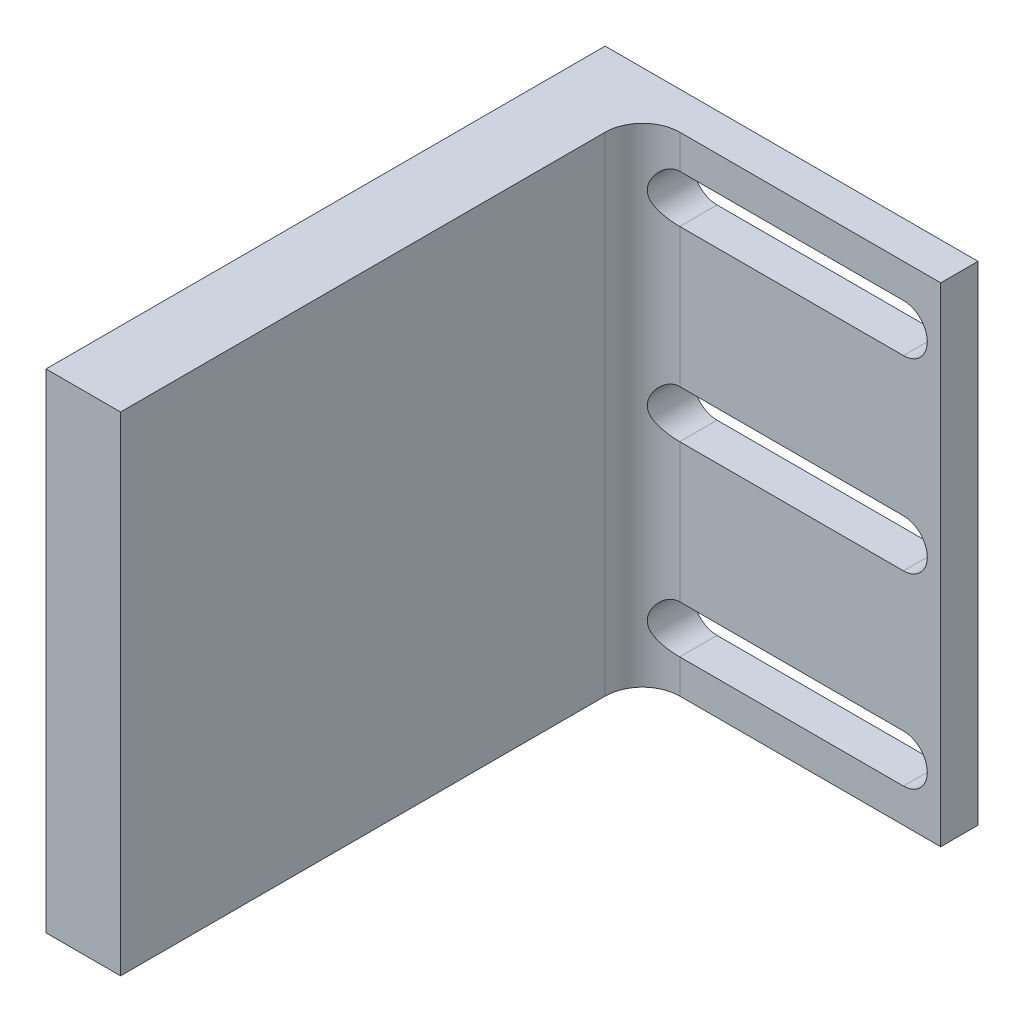
ISO-10303-21;
HEADER;
FILE_DESCRIPTION(('STEP AP214'),'2;1');
FILE_NAME('part.step','',(''),(''),'','','');
FILE_SCHEMA(('AUTOMOTIVE_DESIGN { 1 0 10303 214 1 1 1 1 }'));
ENDSEC;
DATA;
#1=APPLICATION_CONTEXT('core data for automotive mechanical design processes');
#2=APPLICATION_PROTOCOL_DEFINITION('international standard','automotive_design',2000,#1);
#3=PRODUCT_CONTEXT('',#1,'mechanical');
#4=PRODUCT('Part','Part','',(#3));
#5=PRODUCT_RELATED_PRODUCT_CATEGORY('part','',(#4));
#6=PRODUCT_DEFINITION_FORMATION('','',#4);
#7=PRODUCT_DEFINITION_CONTEXT('part definition',#1,'design');
#8=PRODUCT_DEFINITION('design','',#6,#7);
#9=PRODUCT_DEFINITION_SHAPE('','',#8);
#10=(LENGTH_UNIT() NAMED_UNIT(*) SI_UNIT(.MILLI.,.METRE.));
#11=(NAMED_UNIT(*) PLANE_ANGLE_UNIT() SI_UNIT($,.RADIAN.));
#12=(NAMED_UNIT(*) SI_UNIT($,.STERADIAN.) SOLID_ANGLE_UNIT());
#13=UNCERTAINTY_MEASURE_WITH_UNIT(LENGTH_MEASURE(1.E-05),#10,'distance_accuracy_value','');
#14=(GEOMETRIC_REPRESENTATION_CONTEXT(3) GLOBAL_UNCERTAINTY_ASSIGNED_CONTEXT((#13)) GLOBAL_UNIT_ASSIGNED_CONTEXT((#10,
#11,#12)) REPRESENTATION_CONTEXT('',''));
#15=CARTESIAN_POINT('',(0.,0.,0.));
#16=DIRECTION('',(0.,0.,1.));
#17=DIRECTION('',(1.,0.,0.));
#18=AXIS2_PLACEMENT_3D('',#15,#16,#17);
#19=CARTESIAN_POINT('',(0.,0.,5.));
#20=DIRECTION('',(0.,0.,-1.));
#21=DIRECTION('',(-1.,0.,0.));
#22=AXIS2_PLACEMENT_3D('',#19,#20,#21);
#23=PLANE('',#22);
#24=DIRECTION('',(-1.,0.,0.));
#25=VECTOR('',#24,1.);
#26=CARTESIAN_POINT('',(-25.,32.75,5.));
#27=LINE('',#26,#25);
#28=CARTESIAN_POINT('',(25.,32.75,5.));
#29=VERTEX_POINT('',#28);
#30=CARTESIAN_POINT('',(-10.,32.75,5.));
#31=VERTEX_POINT('',#30);
#32=EDGE_CURVE('E300',#29,#31,#27,.T.);
#33=ORIENTED_EDGE('',*,*,#32,.T.);
#34=DIRECTION('',(0.,1.,0.));
#35=VECTOR('',#34,1.);
#36=CARTESIAN_POINT('',(-10.,-32.75,5.));
#37=LINE('',#36,#35);
#38=CARTESIAN_POINT('',(-10.,28.2,5.));
#39=VERTEX_POINT('',#38);
#40=EDGE_CURVE('E332',#31,#39,#37,.F.);
#41=ORIENTED_EDGE('',*,*,#40,.T.);
#42=DIRECTION('',(-1.,0.,0.));
#43=VECTOR('',#42,1.);
#44=CARTESIAN_POINT('',(-10.,28.2,5.));
#45=LINE('',#44,#43);
#46=CARTESIAN_POINT('',(20.,28.2,5.));
#47=VERTEX_POINT('',#46);
#48=EDGE_CURVE('E225',#47,#39,#45,.T.);
#49=ORIENTED_EDGE('',*,*,#48,.F.);
#50=CARTESIAN_POINT('',(20.,25.,5.));
#51=DIRECTION('',(0.,0.,1.));
#52=DIRECTION('',(1.,0.,0.));
#53=AXIS2_PLACEMENT_3D('',#50,#51,#52);
#54=CIRCLE('',#53,3.20000000000001);
#55=CARTESIAN_POINT('',(20.,21.8,5.));
#56=VERTEX_POINT('',#55);
#57=EDGE_CURVE('E238',#56,#47,#54,.T.);
#58=ORIENTED_EDGE('',*,*,#57,.F.);
#59=DIRECTION('',(1.,0.,0.));
#60=VECTOR('',#59,1.);
#61=CARTESIAN_POINT('',(-9.99999999999999,21.8,5.));
#62=LINE('',#61,#60);
#63=CARTESIAN_POINT('',(-9.99999999999999,21.8,5.));
#64=VERTEX_POINT('',#63);
#65=EDGE_CURVE('E235',#64,#56,#62,.T.);
#66=ORIENTED_EDGE('',*,*,#65,.F.);
#67=DIRECTION('',(0.,1.,0.));
#68=VECTOR('',#67,1.);
#69=CARTESIAN_POINT('',(-10.,-32.75,5.));
#70=LINE('',#69,#68);
#71=CARTESIAN_POINT('',(-10.,3.2,5.));
#72=VERTEX_POINT('',#71);
#73=EDGE_CURVE('E330',#64,#72,#70,.F.);
#74=ORIENTED_EDGE('',*,*,#73,.T.);
#75=DIRECTION('',(-1.,0.,0.));
#76=VECTOR('',#75,1.);
#77=CARTESIAN_POINT('',(-10.,3.2,5.));
#78=LINE('',#77,#76);
#79=CARTESIAN_POINT('',(20.,3.2,5.));
#80=VERTEX_POINT('',#79);
#81=EDGE_CURVE('E202',#80,#72,#78,.T.);
#82=ORIENTED_EDGE('',*,*,#81,.F.);
#83=CARTESIAN_POINT('',(20.,0.,5.));
#84=DIRECTION('',(0.,0.,1.));
#85=DIRECTION('',(1.,0.,0.));
#86=AXIS2_PLACEMENT_3D('',#83,#84,#85);
#87=CIRCLE('',#86,3.2);
#88=CARTESIAN_POINT('',(20.,-3.2,5.));
#89=VERTEX_POINT('',#88);
#90=EDGE_CURVE('E205',#89,#80,#87,.T.);
#91=ORIENTED_EDGE('',*,*,#90,.F.);
#92=DIRECTION('',(1.,0.,0.));
#93=VECTOR('',#92,1.);
#94=CARTESIAN_POINT('',(-10.,-3.2,5.));
#95=LINE('',#94,#93);
#96=CARTESIAN_POINT('',(-10.,-3.2,5.));
#97=VERTEX_POINT('',#96);
#98=EDGE_CURVE('E210',#97,#89,#95,.T.);
#99=ORIENTED_EDGE('',*,*,#98,.F.);
#100=DIRECTION('',(0.,1.,0.));
#101=VECTOR('',#100,1.);
#102=CARTESIAN_POINT('',(-10.,-32.75,5.));
#103=LINE('',#102,#101);
#104=CARTESIAN_POINT('',(-9.99999999999999,-21.8,5.));
#105=VERTEX_POINT('',#104);
#106=EDGE_CURVE('E328',#97,#105,#103,.F.);
#107=ORIENTED_EDGE('',*,*,#106,.T.);
#108=DIRECTION('',(-1.,0.,0.));
#109=VECTOR('',#108,1.);
#110=CARTESIAN_POINT('',(-9.99999999999999,-21.8,5.));
#111=LINE('',#110,#109);
#112=CARTESIAN_POINT('',(20.,-21.8,5.));
#113=VERTEX_POINT('',#112);
#114=EDGE_CURVE('E255',#113,#105,#111,.T.);
#115=ORIENTED_EDGE('',*,*,#114,.F.);
#116=CARTESIAN_POINT('',(20.,-25.,5.));
#117=DIRECTION('',(0.,0.,1.));
#118=DIRECTION('',(1.,0.,0.));
#119=AXIS2_PLACEMENT_3D('',#116,#117,#118);
#120=CIRCLE('',#119,3.2);
#121=CARTESIAN_POINT('',(20.,-28.2,5.));
#122=VERTEX_POINT('',#121);
#123=EDGE_CURVE('E267',#122,#113,#120,.T.);
#124=ORIENTED_EDGE('',*,*,#123,.F.);
#125=DIRECTION('',(1.,0.,0.));
#126=VECTOR('',#125,1.);
#127=CARTESIAN_POINT('',(-9.99999999999999,-28.2,5.));
#128=LINE('',#127,#126);
#129=CARTESIAN_POINT('',(-9.99999999999999,-28.2,5.));
#130=VERTEX_POINT('',#129);
#131=EDGE_CURVE('E217',#130,#122,#128,.T.);
#132=ORIENTED_EDGE('',*,*,#131,.F.);
#133=DIRECTION('',(0.,1.,0.));
#134=VECTOR('',#133,1.);
#135=CARTESIAN_POINT('',(-10.,-32.75,5.));
#136=LINE('',#135,#134);
#137=CARTESIAN_POINT('',(-10.,-32.75,5.));
#138=VERTEX_POINT('',#137);
#139=EDGE_CURVE('E68',#130,#138,#136,.F.);
#140=ORIENTED_EDGE('',*,*,#139,.T.);
#141=DIRECTION('',(1.,0.,0.));
#142=VECTOR('',#141,1.);
#143=CARTESIAN_POINT('',(-25.,-32.75,5.));
#144=LINE('',#143,#142);
#145=CARTESIAN_POINT('',(25.,-32.75,5.));
#146=VERTEX_POINT('',#145);
#147=EDGE_CURVE('E303',#138,#146,#144,.T.);
#148=ORIENTED_EDGE('',*,*,#147,.T.);
#149=DIRECTION('',(0.,1.,0.));
#150=VECTOR('',#149,1.);
#151=CARTESIAN_POINT('',(25.,-32.75,5.));
#152=LINE('',#151,#150);
#153=EDGE_CURVE('E297',#146,#29,#152,.T.);
#154=ORIENTED_EDGE('',*,*,#153,.T.);
#155=EDGE_LOOP('',(#33,#41,#49,#58,#66,#74,#82,#91,#99,#107,#115,#124,#132,#140,#148,#154));
#156=FACE_BOUND('',#155,.T.);
#157=ADVANCED_FACE('F44',(#156),#23,.F.);
#158=CARTESIAN_POINT('',(25.,-32.75,5.));
#159=DIRECTION('',(-1.,0.,0.));
#160=DIRECTION('',(0.,0.,1.));
#161=AXIS2_PLACEMENT_3D('',#158,#159,#160);
#162=PLANE('',#161);
#163=DIRECTION('',(0.,1.,0.));
#164=VECTOR('',#163,1.);
#165=CARTESIAN_POINT('',(25.,-32.75,0.));
#166=LINE('',#165,#164);
#167=CARTESIAN_POINT('',(25.,-32.75,0.));
#168=VERTEX_POINT('',#167);
#169=CARTESIAN_POINT('',(25.,32.75,0.));
#170=VERTEX_POINT('',#169);
#171=EDGE_CURVE('E296',#168,#170,#166,.T.);
#172=ORIENTED_EDGE('',*,*,#171,.T.);
#173=DIRECTION('',(0.,0.,-1.));
#174=VECTOR('',#173,1.);
#175=CARTESIAN_POINT('',(25.,32.75,5.));
#176=LINE('',#175,#174);
#177=EDGE_CURVE('E321',#29,#170,#176,.T.);
#178=ORIENTED_EDGE('',*,*,#177,.F.);
#179=ORIENTED_EDGE('',*,*,#153,.F.);
#180=DIRECTION('',(0.,0.,-1.));
#181=VECTOR('',#180,1.);
#182=CARTESIAN_POINT('',(25.,-32.75,5.));
#183=LINE('',#182,#181);
#184=EDGE_CURVE('E305',#146,#168,#183,.T.);
#185=ORIENTED_EDGE('',*,*,#184,.T.);
#186=EDGE_LOOP('',(#172,#178,#179,#185));
#187=FACE_BOUND('',#186,.T.);
#188=ADVANCED_FACE('F406',(#187),#162,.F.);
#189=CARTESIAN_POINT('',(-25.,32.75,5.));
#190=DIRECTION('',(0.,-1.,0.));
#191=DIRECTION('',(0.,0.,-1.));
#192=AXIS2_PLACEMENT_3D('',#189,#190,#191);
#193=PLANE('',#192);
#194=DIRECTION('',(-1.,0.,0.));
#195=VECTOR('',#194,1.);
#196=CARTESIAN_POINT('',(-25.,32.75,0.));
#197=LINE('',#196,#195);
#198=CARTESIAN_POINT('',(-25.,32.75,0.));
#199=VERTEX_POINT('',#198);
#200=EDGE_CURVE('E308',#170,#199,#197,.T.);
#201=ORIENTED_EDGE('',*,*,#200,.T.);
#202=DIRECTION('',(0.,0.,-1.));
#203=VECTOR('',#202,1.);
#204=CARTESIAN_POINT('',(-25.,32.75,5.));
#205=LINE('',#204,#203);
#206=CARTESIAN_POINT('',(-25.,32.75,75.));
#207=VERTEX_POINT('',#206);
#208=EDGE_CURVE('E318',#207,#199,#205,.T.);
#209=ORIENTED_EDGE('',*,*,#208,.F.);
#210=DIRECTION('',(-1.,0.,0.));
#211=VECTOR('',#210,1.);
#212=CARTESIAN_POINT('',(-25.,32.75,75.));
#213=LINE('',#212,#211);
#214=CARTESIAN_POINT('',(-15.,32.75,75.));
#215=VERTEX_POINT('',#214);
#216=EDGE_CURVE('E288',#215,#207,#213,.T.);
#217=ORIENTED_EDGE('',*,*,#216,.F.);
#218=DIRECTION('',(0.,0.,-1.));
#219=VECTOR('',#218,1.);
#220=CARTESIAN_POINT('',(-15.,32.75,75.));
#221=LINE('',#220,#219);
#222=CARTESIAN_POINT('',(-15.,32.75,9.99999999999999));
#223=VERTEX_POINT('',#222);
#224=EDGE_CURVE('E291',#215,#223,#221,.T.);
#225=ORIENTED_EDGE('',*,*,#224,.T.);
#226=CARTESIAN_POINT('',(-10.,32.75,9.99999999999999));
#227=DIRECTION('',(0.,-1.,0.));
#228=DIRECTION('',(0.,0.,-1.));
#229=AXIS2_PLACEMENT_3D('',#226,#227,#228);
#230=CIRCLE('',#229,5.);
#231=EDGE_CURVE('E60',#223,#31,#230,.T.);
#232=ORIENTED_EDGE('',*,*,#231,.T.);
#233=ORIENTED_EDGE('',*,*,#32,.F.);
#234=ORIENTED_EDGE('',*,*,#177,.T.);
#235=EDGE_LOOP('',(#201,#209,#217,#225,#232,#233,#234));
#236=FACE_BOUND('',#235,.T.);
#237=ADVANCED_FACE('F433',(#236),#193,.F.);
#238=CARTESIAN_POINT('',(-25.,-32.75,5.));
#239=DIRECTION('',(1.,0.,0.));
#240=DIRECTION('',(0.,0.,-1.));
#241=AXIS2_PLACEMENT_3D('',#238,#239,#240);
#242=PLANE('',#241);
#243=DIRECTION('',(0.,-1.,0.));
#244=VECTOR('',#243,1.);
#245=CARTESIAN_POINT('',(-25.,-32.75,0.));
#246=LINE('',#245,#244);
#247=CARTESIAN_POINT('',(-25.,-32.75,0.));
#248=VERTEX_POINT('',#247);
#249=EDGE_CURVE('E310',#199,#248,#246,.T.);
#250=ORIENTED_EDGE('',*,*,#249,.T.);
#251=DIRECTION('',(0.,0.,-1.));
#252=VECTOR('',#251,1.);
#253=CARTESIAN_POINT('',(-25.,-32.75,5.));
#254=LINE('',#253,#252);
#255=CARTESIAN_POINT('',(-25.,-32.75,75.));
#256=VERTEX_POINT('',#255);
#257=EDGE_CURVE('E315',#256,#248,#254,.T.);
#258=ORIENTED_EDGE('',*,*,#257,.F.);
#259=DIRECTION('',(0.,-1.,0.));
#260=VECTOR('',#259,1.);
#261=CARTESIAN_POINT('',(-25.,-32.75,75.));
#262=LINE('',#261,#260);
#263=EDGE_CURVE('E275',#207,#256,#262,.T.);
#264=ORIENTED_EDGE('',*,*,#263,.F.);
#265=ORIENTED_EDGE('',*,*,#208,.T.);
#266=EDGE_LOOP('',(#250,#258,#264,#265));
#267=FACE_BOUND('',#266,.T.);
#268=ADVANCED_FACE('F439',(#267),#242,.F.);
#269=CARTESIAN_POINT('',(-25.,-32.75,5.));
#270=DIRECTION('',(0.,1.,0.));
#271=DIRECTION('',(0.,0.,1.));
#272=AXIS2_PLACEMENT_3D('',#269,#270,#271);
#273=PLANE('',#272);
#274=DIRECTION('',(1.,0.,0.));
#275=VECTOR('',#274,1.);
#276=CARTESIAN_POINT('',(-25.,-32.75,0.));
#277=LINE('',#276,#275);
#278=EDGE_CURVE('E301',#248,#168,#277,.T.);
#279=ORIENTED_EDGE('',*,*,#278,.T.);
#280=ORIENTED_EDGE('',*,*,#184,.F.);
#281=ORIENTED_EDGE('',*,*,#147,.F.);
#282=CARTESIAN_POINT('',(-10.,-32.75,9.99999999999999));
#283=DIRECTION('',(0.,1.,0.));
#284=DIRECTION('',(0.,0.,1.));
#285=AXIS2_PLACEMENT_3D('',#282,#283,#284);
#286=CIRCLE('',#285,5.);
#287=CARTESIAN_POINT('',(-15.,-32.75,9.99999999999999));
#288=VERTEX_POINT('',#287);
#289=EDGE_CURVE('E12',#138,#288,#286,.T.);
#290=ORIENTED_EDGE('',*,*,#289,.T.);
#291=DIRECTION('',(0.,0.,-1.));
#292=VECTOR('',#291,1.);
#293=CARTESIAN_POINT('',(-15.,-32.75,75.));
#294=LINE('',#293,#292);
#295=CARTESIAN_POINT('',(-15.,-32.75,75.));
#296=VERTEX_POINT('',#295);
#297=EDGE_CURVE('E293',#296,#288,#294,.T.);
#298=ORIENTED_EDGE('',*,*,#297,.F.);
#299=DIRECTION('',(1.,0.,0.));
#300=VECTOR('',#299,1.);
#301=CARTESIAN_POINT('',(-25.,-32.75,75.));
#302=LINE('',#301,#300);
#303=EDGE_CURVE('E284',#256,#296,#302,.T.);
#304=ORIENTED_EDGE('',*,*,#303,.F.);
#305=ORIENTED_EDGE('',*,*,#257,.T.);
#306=EDGE_LOOP('',(#279,#280,#281,#290,#298,#304,#305));
#307=FACE_BOUND('',#306,.T.);
#308=ADVANCED_FACE('F389',(#307),#273,.F.);
#309=CARTESIAN_POINT('',(0.,0.,0.));
#310=DIRECTION('',(0.,0.,-1.));
#311=DIRECTION('',(-1.,0.,0.));
#312=AXIS2_PLACEMENT_3D('',#309,#310,#311);
#313=PLANE('',#312);
#314=CARTESIAN_POINT('',(-10.,0.,0.));
#315=DIRECTION('',(0.,0.,1.));
#316=DIRECTION('',(1.,0.,0.));
#317=AXIS2_PLACEMENT_3D('',#314,#315,#316);
#318=CIRCLE('',#317,3.2);
#319=CARTESIAN_POINT('',(-10.,3.2,0.));
#320=VERTEX_POINT('',#319);
#321=CARTESIAN_POINT('',(-10.,-3.2,0.));
#322=VERTEX_POINT('',#321);
#323=EDGE_CURVE('E181',#320,#322,#318,.T.);
#324=ORIENTED_EDGE('',*,*,#323,.T.);
#325=DIRECTION('',(1.,0.,0.));
#326=VECTOR('',#325,1.);
#327=CARTESIAN_POINT('',(-10.,-3.2,0.));
#328=LINE('',#327,#326);
#329=CARTESIAN_POINT('',(20.,-3.2,0.));
#330=VERTEX_POINT('',#329);
#331=EDGE_CURVE('E193',#322,#330,#328,.T.);
#332=ORIENTED_EDGE('',*,*,#331,.T.);
#333=CARTESIAN_POINT('',(20.,0.,0.));
#334=DIRECTION('',(0.,0.,1.));
#335=DIRECTION('',(1.,0.,0.));
#336=AXIS2_PLACEMENT_3D('',#333,#334,#335);
#337=CIRCLE('',#336,3.2);
#338=CARTESIAN_POINT('',(20.,3.2,0.));
#339=VERTEX_POINT('',#338);
#340=EDGE_CURVE('E197',#330,#339,#337,.T.);
#341=ORIENTED_EDGE('',*,*,#340,.T.);
#342=DIRECTION('',(-1.,0.,0.));
#343=VECTOR('',#342,1.);
#344=CARTESIAN_POINT('',(-10.,3.2,0.));
#345=LINE('',#344,#343);
#346=EDGE_CURVE('E189',#339,#320,#345,.T.);
#347=ORIENTED_EDGE('',*,*,#346,.T.);
#348=EDGE_LOOP('',(#324,#332,#341,#347));
#349=FACE_BOUND('',#348,.T.);
#350=CARTESIAN_POINT('',(-10.,25.,0.));
#351=DIRECTION('',(0.,0.,1.));
#352=DIRECTION('',(1.,0.,0.));
#353=AXIS2_PLACEMENT_3D('',#350,#351,#352);
#354=CIRCLE('',#353,3.2);
#355=CARTESIAN_POINT('',(-10.,28.2,0.));
#356=VERTEX_POINT('',#355);
#357=CARTESIAN_POINT('',(-9.99999999999999,21.8,0.));
#358=VERTEX_POINT('',#357);
#359=EDGE_CURVE('E221',#356,#358,#354,.T.);
#360=ORIENTED_EDGE('',*,*,#359,.T.);
#361=DIRECTION('',(1.,0.,0.));
#362=VECTOR('',#361,1.);
#363=CARTESIAN_POINT('',(-9.99999999999999,21.8,0.));
#364=LINE('',#363,#362);
#365=CARTESIAN_POINT('',(20.,21.8,0.));
#366=VERTEX_POINT('',#365);
#367=EDGE_CURVE('E224',#358,#366,#364,.T.);
#368=ORIENTED_EDGE('',*,*,#367,.T.);
#369=CARTESIAN_POINT('',(20.,25.,0.));
#370=DIRECTION('',(0.,0.,1.));
#371=DIRECTION('',(1.,0.,0.));
#372=AXIS2_PLACEMENT_3D('',#369,#370,#371);
#373=CIRCLE('',#372,3.20000000000001);
#374=CARTESIAN_POINT('',(20.,28.2,0.));
#375=VERTEX_POINT('',#374);
#376=EDGE_CURVE('E228',#366,#375,#373,.T.);
#377=ORIENTED_EDGE('',*,*,#376,.T.);
#378=DIRECTION('',(-1.,0.,0.));
#379=VECTOR('',#378,1.);
#380=CARTESIAN_POINT('',(-10.,28.2,0.));
#381=LINE('',#380,#379);
#382=EDGE_CURVE('E231',#375,#356,#381,.T.);
#383=ORIENTED_EDGE('',*,*,#382,.T.);
#384=EDGE_LOOP('',(#360,#368,#377,#383));
#385=FACE_BOUND('',#384,.T.);
#386=CARTESIAN_POINT('',(-9.99999999999999,-25.,0.));
#387=DIRECTION('',(0.,0.,1.));
#388=DIRECTION('',(1.,0.,0.));
#389=AXIS2_PLACEMENT_3D('',#386,#387,#388);
#390=CIRCLE('',#389,3.2);
#391=CARTESIAN_POINT('',(-9.99999999999999,-21.8,0.));
#392=VERTEX_POINT('',#391);
#393=CARTESIAN_POINT('',(-9.99999999999999,-28.2,0.));
#394=VERTEX_POINT('',#393);
#395=EDGE_CURVE('E251',#392,#394,#390,.T.);
#396=ORIENTED_EDGE('',*,*,#395,.T.);
#397=DIRECTION('',(1.,0.,0.));
#398=VECTOR('',#397,1.);
#399=CARTESIAN_POINT('',(-9.99999999999999,-28.2,0.));
#400=LINE('',#399,#398);
#401=CARTESIAN_POINT('',(20.,-28.2,0.));
#402=VERTEX_POINT('',#401);
#403=EDGE_CURVE('E254',#394,#402,#400,.T.);
#404=ORIENTED_EDGE('',*,*,#403,.T.);
#405=CARTESIAN_POINT('',(20.,-25.,0.));
#406=DIRECTION('',(0.,0.,1.));
#407=DIRECTION('',(1.,0.,0.));
#408=AXIS2_PLACEMENT_3D('',#405,#406,#407);
#409=CIRCLE('',#408,3.2);
#410=CARTESIAN_POINT('',(20.,-21.8,0.));
#411=VERTEX_POINT('',#410);
#412=EDGE_CURVE('E258',#402,#411,#409,.T.);
#413=ORIENTED_EDGE('',*,*,#412,.T.);
#414=DIRECTION('',(-1.,0.,0.));
#415=VECTOR('',#414,1.);
#416=CARTESIAN_POINT('',(-9.99999999999999,-21.8,0.));
#417=LINE('',#416,#415);
#418=EDGE_CURVE('E261',#411,#392,#417,.T.);
#419=ORIENTED_EDGE('',*,*,#418,.T.);
#420=EDGE_LOOP('',(#396,#404,#413,#419));
#421=FACE_BOUND('',#420,.T.);
#422=ORIENTED_EDGE('',*,*,#171,.F.);
#423=ORIENTED_EDGE('',*,*,#278,.F.);
#424=ORIENTED_EDGE('',*,*,#249,.F.);
#425=ORIENTED_EDGE('',*,*,#200,.F.);
#426=EDGE_LOOP('',(#422,#423,#424,#425));
#427=FACE_BOUND('',#426,.T.);
#428=ADVANCED_FACE('F199',(#349,#385,#421,#427),#313,.T.);
#429=CARTESIAN_POINT('',(-15.,-32.75,75.));
#430=DIRECTION('',(-1.,0.,0.));
#431=DIRECTION('',(0.,0.,1.));
#432=AXIS2_PLACEMENT_3D('',#429,#430,#431);
#433=PLANE('',#432);
#434=ORIENTED_EDGE('',*,*,#297,.T.);
#435=DIRECTION('',(0.,1.,0.));
#436=VECTOR('',#435,1.);
#437=CARTESIAN_POINT('',(-15.,32.75,9.99999999999999));
#438=LINE('',#437,#436);
#439=EDGE_CURVE('E324',#288,#223,#438,.T.);
#440=ORIENTED_EDGE('',*,*,#439,.T.);
#441=ORIENTED_EDGE('',*,*,#224,.F.);
#442=DIRECTION('',(0.,1.,0.));
#443=VECTOR('',#442,1.);
#444=CARTESIAN_POINT('',(-15.,-32.75,75.));
#445=LINE('',#444,#443);
#446=EDGE_CURVE('E286',#296,#215,#445,.T.);
#447=ORIENTED_EDGE('',*,*,#446,.F.);
#448=EDGE_LOOP('',(#434,#440,#441,#447));
#449=FACE_BOUND('',#448,.T.);
#450=ADVANCED_FACE('F394',(#449),#433,.F.);
#451=CARTESIAN_POINT('',(0.,0.,75.));
#452=DIRECTION('',(0.,0.,-1.));
#453=DIRECTION('',(-1.,0.,0.));
#454=AXIS2_PLACEMENT_3D('',#451,#452,#453);
#455=PLANE('',#454);
#456=ORIENTED_EDGE('',*,*,#263,.T.);
#457=ORIENTED_EDGE('',*,*,#303,.T.);
#458=ORIENTED_EDGE('',*,*,#446,.T.);
#459=ORIENTED_EDGE('',*,*,#216,.T.);
#460=EDGE_LOOP('',(#456,#457,#458,#459));
#461=FACE_BOUND('',#460,.T.);
#462=ADVANCED_FACE('F370',(#461),#455,.F.);
#463=CARTESIAN_POINT('',(-9.99999999999999,-25.,0.));
#464=DIRECTION('',(0.,0.,1.));
#465=DIRECTION('',(1.,0.,0.));
#466=AXIS2_PLACEMENT_3D('',#463,#464,#465);
#467=CYLINDRICAL_SURFACE('',#466,3.2);
#468=DIRECTION('',(0.,0.,1.));
#469=VECTOR('',#468,1.);
#470=CARTESIAN_POINT('',(-9.99999999999999,-21.8,0.));
#471=LINE('',#470,#469);
#472=EDGE_CURVE('E272',#392,#105,#471,.T.);
#473=ORIENTED_EDGE('',*,*,#472,.T.);
#474=CARTESIAN_POINT('',(-10.,-21.8,5.));
#475=CARTESIAN_POINT('',(-10.0813396540225,-21.7999845362489,4.99998300431597));
#476=CARTESIAN_POINT('',(-10.1626677298003,-21.8031008131518,5.00198434516247));
#477=CARTESIAN_POINT('',(-10.3246207393052,-21.8154769332813,5.00989521109206));
#478=CARTESIAN_POINT('',(-10.4052460309844,-21.8247334383784,5.01580261264311));
#479=CARTESIAN_POINT('',(-10.5647334724676,-21.8491982779311,5.03135156945973));
#480=CARTESIAN_POINT('',(-10.6436031967669,-21.8643713342946,5.04097098794595));
#481=CARTESIAN_POINT('',(-10.7994907191361,-21.9004478382154,5.06370284501653));
#482=CARTESIAN_POINT('',(-10.8765083482962,-21.9213518062877,5.07681560088324));
#483=CARTESIAN_POINT('',(-11.1037318798894,-21.9922001984694,5.12091504117343));
#484=CARTESIAN_POINT('',(-11.2505452465753,-22.0503498360077,5.15670787018109));
#485=CARTESIAN_POINT('',(-11.531896721577,-22.1861428198377,5.23818843808653));
#486=CARTESIAN_POINT('',(-11.6664192449443,-22.2638104599755,5.28388849859904));
#487=CARTESIAN_POINT('',(-11.9316187808378,-22.4433380190047,5.38582526267831));
#488=CARTESIAN_POINT('',(-12.0610979910149,-22.5466496139143,5.44261604878338));
#489=CARTESIAN_POINT('',(-12.3020305877543,-22.7711383973519,5.55943367891357));
#490=CARTESIAN_POINT('',(-12.4134612655794,-22.8923377316392,5.61946447491591));
#491=CARTESIAN_POINT('',(-12.6314609369031,-23.1694743415797,5.74635727859969));
#492=CARTESIAN_POINT('',(-12.7350396303826,-23.3279007469461,5.81296394908428));
#493=CARTESIAN_POINT('',(-12.9138519449361,-23.6637734024207,5.93536810786921));
#494=CARTESIAN_POINT('',(-12.9891346490844,-23.8411860250247,5.99118423130575));
#495=CARTESIAN_POINT('',(-13.0914395907368,-24.1614726880784,6.06986095858892));
#496=CARTESIAN_POINT('',(-13.1260036224281,-24.3007421668215,6.09755040085482));
#497=CARTESIAN_POINT('',(-13.1761924729833,-24.584661689791,6.13828034075044));
#498=CARTESIAN_POINT('',(-13.1918458426846,-24.7293032821325,6.15134291946161));
#499=CARTESIAN_POINT('',(-13.2032573921586,-25.0203873596916,6.16083198494021));
#500=CARTESIAN_POINT('',(-13.1989541763532,-25.1668340181609,6.15720713379743));
#501=CARTESIAN_POINT('',(-13.170615314096,-25.4565314915634,6.13379912761968));
#502=CARTESIAN_POINT('',(-13.1465634202304,-25.5997795752887,6.1140026681266));
#503=CARTESIAN_POINT('',(-13.0811715767247,-25.8751214399992,6.06197530676626));
#504=CARTESIAN_POINT('',(-13.0403678196073,-26.0074203601253,6.03013227638626));
#505=CARTESIAN_POINT('',(-12.9431819977697,-26.2635115184466,5.95755647296655));
#506=CARTESIAN_POINT('',(-12.8867948390887,-26.3873009584798,5.91682079398075));
#507=CARTESIAN_POINT('',(-12.7475331790799,-26.6483258558345,5.82154729812859));
#508=CARTESIAN_POINT('',(-12.6616453659175,-26.7835335181353,5.76586369885396));
#509=CARTESIAN_POINT('',(-12.4712951981812,-27.0391515640847,5.6520082884736));
#510=CARTESIAN_POINT('',(-12.3668109454451,-27.1595442165651,5.59383360601127));
#511=CARTESIAN_POINT('',(-12.1198474035045,-27.4045258104577,5.46914105576565));
#512=CARTESIAN_POINT('',(-11.9739139673729,-27.5258818310081,5.40303454389572));
#513=CARTESIAN_POINT('',(-11.6600900226339,-27.742326129652,5.28063489592803));
#514=CARTESIAN_POINT('',(-11.4922187222248,-27.8374371630648,5.22433327437411));
#515=CARTESIAN_POINT('',(-11.1731416629384,-27.9812697073339,5.13734815638161));
#516=CARTESIAN_POINT('',(-11.0252000595825,-28.0354445662925,5.10380068167671));
#517=CARTESIAN_POINT('',(-10.7971017973617,-28.1001431432412,5.06333960362202));
#518=CARTESIAN_POINT('',(-10.7200811847308,-28.118943046052,5.05149965821963));
#519=CARTESIAN_POINT('',(-10.5644247327878,-28.1508292429865,5.03134124460814));
#520=CARTESIAN_POINT('',(-10.4857896051441,-28.1639180002429,5.02302125833982));
#521=CARTESIAN_POINT('',(-10.33935210104,-28.1826782943164,5.0110726829199));
#522=CARTESIAN_POINT('',(-10.2716948507371,-28.1891681218252,5.00692745516905));
#523=CARTESIAN_POINT('',(-10.1360281079537,-28.1978313285439,5.0013879035743));
#524=CARTESIAN_POINT('',(-10.0680188142854,-28.2000069235186,4.99999216760971));
#525=CARTESIAN_POINT('',(-10.,-28.2000000000001,4.99999999999996));
#526=B_SPLINE_CURVE_WITH_KNOTS('',3,(#474,#475,#476,#477,#478,#479,#480,#481,#482,#483,#484,
#485,#486,#487,#488,#489,#490,#491,#492,#493,#494,#495,#496,#497,#498,#499,#500,#501,#502,#503,
#504,#505,#506,#507,#508,#509,#510,#511,#512,#513,#514,#515,#516,#517,#518,#519,#520,#521,#522,
#523,#524,#525),.UNSPECIFIED.,.F.,.F.,(4,2,2,2,2,2,2,2,2,2,2,2,2,2,2,2,2,2,2,2,2,2,2,2,2,4),(0.,
0.243915644597637,0.487698793230457,0.730050053725997,0.97242333328194,1.45585352719289,
1.93988844781809,2.46320025640892,2.9871654674315,3.58629180612666,4.18437403267635,
4.62100726803787,5.05698045846439,5.49429578987945,5.93197126544342,6.35661220802699,
6.78139212335752,7.28830089678923,7.79581057610322,8.39579912373709,8.99526581401903,
9.47624646851207,9.71647832438032,9.95660646914081,10.1607013096439,10.3646913010384),.UNSPECIFIED.);
#527=EDGE_CURVE('E53',#105,#130,#526,.T.);
#528=ORIENTED_EDGE('',*,*,#527,.T.);
#529=DIRECTION('',(0.,0.,1.));
#530=VECTOR('',#529,1.);
#531=CARTESIAN_POINT('',(-9.99999999999999,-28.2,0.));
#532=LINE('',#531,#530);
#533=EDGE_CURVE('E264',#394,#130,#532,.T.);
#534=ORIENTED_EDGE('',*,*,#533,.F.);
#535=ORIENTED_EDGE('',*,*,#395,.F.);
#536=EDGE_LOOP('',(#473,#528,#534,#535));
#537=FACE_BOUND('',#536,.T.);
#538=ADVANCED_FACE('F359',(#537),#467,.F.);
#539=CARTESIAN_POINT('',(-9.99999999999999,-21.8,0.));
#540=DIRECTION('',(0.,1.,0.));
#541=DIRECTION('',(-1.,0.,0.));
#542=AXIS2_PLACEMENT_3D('',#539,#540,#541);
#543=PLANE('',#542);
#544=ORIENTED_EDGE('',*,*,#114,.T.);
#545=ORIENTED_EDGE('',*,*,#472,.F.);
#546=ORIENTED_EDGE('',*,*,#418,.F.);
#547=DIRECTION('',(0.,0.,1.));
#548=VECTOR('',#547,1.);
#549=CARTESIAN_POINT('',(20.,-21.8,0.));
#550=LINE('',#549,#548);
#551=EDGE_CURVE('E276',#411,#113,#550,.T.);
#552=ORIENTED_EDGE('',*,*,#551,.T.);
#553=EDGE_LOOP('',(#544,#545,#546,#552));
#554=FACE_BOUND('',#553,.T.);
#555=ADVANCED_FACE('F355',(#554),#543,.F.);
#556=CARTESIAN_POINT('',(20.,-25.,0.));
#557=DIRECTION('',(0.,0.,1.));
#558=DIRECTION('',(1.,0.,0.));
#559=AXIS2_PLACEMENT_3D('',#556,#557,#558);
#560=CYLINDRICAL_SURFACE('',#559,3.2);
#561=ORIENTED_EDGE('',*,*,#123,.T.);
#562=ORIENTED_EDGE('',*,*,#551,.F.);
#563=ORIENTED_EDGE('',*,*,#412,.F.);
#564=DIRECTION('',(0.,0.,1.));
#565=VECTOR('',#564,1.);
#566=CARTESIAN_POINT('',(20.,-28.2,0.));
#567=LINE('',#566,#565);
#568=EDGE_CURVE('E278',#402,#122,#567,.T.);
#569=ORIENTED_EDGE('',*,*,#568,.T.);
#570=EDGE_LOOP('',(#561,#562,#563,#569));
#571=FACE_BOUND('',#570,.T.);
#572=ADVANCED_FACE('F358',(#571),#560,.F.);
#573=CARTESIAN_POINT('',(-9.99999999999999,-28.2,0.));
#574=DIRECTION('',(0.,-1.,0.));
#575=DIRECTION('',(1.,0.,0.));
#576=AXIS2_PLACEMENT_3D('',#573,#574,#575);
#577=PLANE('',#576);
#578=ORIENTED_EDGE('',*,*,#131,.T.);
#579=ORIENTED_EDGE('',*,*,#568,.F.);
#580=ORIENTED_EDGE('',*,*,#403,.F.);
#581=ORIENTED_EDGE('',*,*,#533,.T.);
#582=EDGE_LOOP('',(#578,#579,#580,#581));
#583=FACE_BOUND('',#582,.T.);
#584=ADVANCED_FACE('F351',(#583),#577,.F.);
#585=CARTESIAN_POINT('',(-10.,25.,0.));
#586=DIRECTION('',(0.,0.,1.));
#587=DIRECTION('',(1.,0.,0.));
#588=AXIS2_PLACEMENT_3D('',#585,#586,#587);
#589=CYLINDRICAL_SURFACE('',#588,3.2);
#590=DIRECTION('',(0.,0.,1.));
#591=VECTOR('',#590,1.);
#592=CARTESIAN_POINT('',(-10.,28.2,0.));
#593=LINE('',#592,#591);
#594=EDGE_CURVE('E212',#356,#39,#593,.T.);
#595=ORIENTED_EDGE('',*,*,#594,.T.);
#596=CARTESIAN_POINT('',(-10.,28.2,5.));
#597=CARTESIAN_POINT('',(-10.0813396540225,28.2000154637511,4.99998300431597));
#598=CARTESIAN_POINT('',(-10.1626677298003,28.1968991868483,5.00198434516247));
#599=CARTESIAN_POINT('',(-10.3246207393052,28.1845230667187,5.00989521109206));
#600=CARTESIAN_POINT('',(-10.4052460309844,28.1752665616216,5.01580261264311));
#601=CARTESIAN_POINT('',(-10.5647334724676,28.1508017220689,5.03135156945973));
#602=CARTESIAN_POINT('',(-10.6436031967669,28.1356286657054,5.04097098794595));
#603=CARTESIAN_POINT('',(-10.7994907191361,28.0995521617846,5.06370284501653));
#604=CARTESIAN_POINT('',(-10.8765083482962,28.0786481937123,5.07681560088324));
#605=CARTESIAN_POINT('',(-11.1037318798894,28.0077998015306,5.12091504117343));
#606=CARTESIAN_POINT('',(-11.2505452465753,27.9496501639923,5.15670787018109));
#607=CARTESIAN_POINT('',(-11.531896721577,27.8138571801623,5.23818843808653));
#608=CARTESIAN_POINT('',(-11.6664192449443,27.7361895400245,5.28388849859904));
#609=CARTESIAN_POINT('',(-11.9316187808378,27.5566619809953,5.38582526267831));
#610=CARTESIAN_POINT('',(-12.0610979910149,27.4533503860857,5.44261604878338));
#611=CARTESIAN_POINT('',(-12.3020305877543,27.2288616026481,5.55943367891357));
#612=CARTESIAN_POINT('',(-12.4134612655794,27.1076622683608,5.61946447491591));
#613=CARTESIAN_POINT('',(-12.6314609369031,26.8305256584203,5.74635727859969));
#614=CARTESIAN_POINT('',(-12.7350396303826,26.6720992530539,5.81296394908428));
#615=CARTESIAN_POINT('',(-12.9138519449361,26.3362265975793,5.93536810786921));
#616=CARTESIAN_POINT('',(-12.9891346490844,26.1588139749753,5.99118423130575));
#617=CARTESIAN_POINT('',(-13.0914395907368,25.8385273119216,6.06986095858892));
#618=CARTESIAN_POINT('',(-13.1260036224281,25.6992578331785,6.09755040085482));
#619=CARTESIAN_POINT('',(-13.1761924729833,25.415338310209,6.13828034075045));
#620=CARTESIAN_POINT('',(-13.1918458426846,25.2706967178675,6.15134291946161));
#621=CARTESIAN_POINT('',(-13.2032573921586,24.9796126403085,6.16083198494021));
#622=CARTESIAN_POINT('',(-13.1989541763532,24.8331659818391,6.15720713379743));
#623=CARTESIAN_POINT('',(-13.170615314096,24.5434685084366,6.13379912761968));
#624=CARTESIAN_POINT('',(-13.1465634202304,24.4002204247113,6.1140026681266));
#625=CARTESIAN_POINT('',(-13.0811715767248,24.1248785600008,6.06197530676626));
#626=CARTESIAN_POINT('',(-13.0403678196073,23.9925796398747,6.03013227638627));
#627=CARTESIAN_POINT('',(-12.9431819977697,23.7364884815534,5.95755647296655));
#628=CARTESIAN_POINT('',(-12.8867948390887,23.6126990415202,5.91682079398075));
#629=CARTESIAN_POINT('',(-12.74753317908,23.3516741441655,5.8215472981286));
#630=CARTESIAN_POINT('',(-12.6616453659176,23.2164664818647,5.76586369885397));
#631=CARTESIAN_POINT('',(-12.4712951981812,22.9608484359153,5.65200828847361));
#632=CARTESIAN_POINT('',(-12.3668109454451,22.8404557834349,5.59383360601127));
#633=CARTESIAN_POINT('',(-12.1198474035045,22.5954741895423,5.46914105576565));
#634=CARTESIAN_POINT('',(-11.9739139673729,22.4741181689919,5.40303454389572));
#635=CARTESIAN_POINT('',(-11.6600900226339,22.257673870348,5.28063489592803));
#636=CARTESIAN_POINT('',(-11.4922187222248,22.1625628369352,5.22433327437412));
#637=CARTESIAN_POINT('',(-11.1731416629384,22.0187302926661,5.13734815638161));
#638=CARTESIAN_POINT('',(-11.0252000595825,21.9645554337075,5.10380068167671));
#639=CARTESIAN_POINT('',(-10.7971017973617,21.8998568567588,5.06333960362202));
#640=CARTESIAN_POINT('',(-10.7200811847308,21.881056953948,5.05149965821963));
#641=CARTESIAN_POINT('',(-10.5644247327878,21.8491707570135,5.03134124460815));
#642=CARTESIAN_POINT('',(-10.4857896051441,21.8360819997571,5.02302125833983));
#643=CARTESIAN_POINT('',(-10.33935210104,21.8173217056836,5.0110726829199));
#644=CARTESIAN_POINT('',(-10.2716948507372,21.8108318781748,5.00692745516906));
#645=CARTESIAN_POINT('',(-10.1360281079537,21.8021686714561,5.0013879035743));
#646=CARTESIAN_POINT('',(-10.0680188142854,21.7999930764814,4.99999216760971));
#647=CARTESIAN_POINT('',(-10.,21.7999999999999,4.99999999999996));
#648=B_SPLINE_CURVE_WITH_KNOTS('',3,(#596,#597,#598,#599,#600,#601,#602,#603,#604,#605,#606,
#607,#608,#609,#610,#611,#612,#613,#614,#615,#616,#617,#618,#619,#620,#621,#622,#623,#624,#625,
#626,#627,#628,#629,#630,#631,#632,#633,#634,#635,#636,#637,#638,#639,#640,#641,#642,#643,#644,
#645,#646,#647),.UNSPECIFIED.,.F.,.F.,(4,2,2,2,2,2,2,2,2,2,2,2,2,2,2,2,2,2,2,2,2,2,2,2,2,4),(0.,
0.243915644597637,0.487698793230457,0.730050053725997,0.97242333328194,1.45585352719289,
1.93988844781809,2.46320025640893,2.9871654674315,3.58629180612667,4.18437403267635,
4.62100726803787,5.05698045846438,5.49429578987945,5.93197126544342,6.35661220802698,
6.78139212335751,7.28830089678922,7.79581057610321,8.39579912373708,8.99526581401902,
9.47624646851206,9.71647832438031,9.9566064691408,10.1607013096439,10.3646913010384),.UNSPECIFIED.);
#649=EDGE_CURVE('E335',#39,#64,#648,.T.);
#650=ORIENTED_EDGE('',*,*,#649,.T.);
#651=DIRECTION('',(0.,0.,1.));
#652=VECTOR('',#651,1.);
#653=CARTESIAN_POINT('',(-9.99999999999999,21.8,0.));
#654=LINE('',#653,#652);
#655=EDGE_CURVE('E234',#358,#64,#654,.T.);
#656=ORIENTED_EDGE('',*,*,#655,.F.);
#657=ORIENTED_EDGE('',*,*,#359,.F.);
#658=EDGE_LOOP('',(#595,#650,#656,#657));
#659=FACE_BOUND('',#658,.T.);
#660=ADVANCED_FACE('F345',(#659),#589,.F.);
#661=CARTESIAN_POINT('',(-10.,28.2,0.));
#662=DIRECTION('',(0.,1.,0.));
#663=DIRECTION('',(-1.,0.,0.));
#664=AXIS2_PLACEMENT_3D('',#661,#662,#663);
#665=PLANE('',#664);
#666=ORIENTED_EDGE('',*,*,#48,.T.);
#667=ORIENTED_EDGE('',*,*,#594,.F.);
#668=ORIENTED_EDGE('',*,*,#382,.F.);
#669=DIRECTION('',(0.,0.,1.));
#670=VECTOR('',#669,1.);
#671=CARTESIAN_POINT('',(20.,28.2,0.));
#672=LINE('',#671,#670);
#673=EDGE_CURVE('E245',#375,#47,#672,.T.);
#674=ORIENTED_EDGE('',*,*,#673,.T.);
#675=EDGE_LOOP('',(#666,#667,#668,#674));
#676=FACE_BOUND('',#675,.T.);
#677=ADVANCED_FACE('F350',(#676),#665,.F.);
#678=CARTESIAN_POINT('',(20.,25.,0.));
#679=DIRECTION('',(0.,0.,1.));
#680=DIRECTION('',(1.,0.,0.));
#681=AXIS2_PLACEMENT_3D('',#678,#679,#680);
#682=CYLINDRICAL_SURFACE('',#681,3.20000000000001);
#683=ORIENTED_EDGE('',*,*,#57,.T.);
#684=ORIENTED_EDGE('',*,*,#673,.F.);
#685=ORIENTED_EDGE('',*,*,#376,.F.);
#686=DIRECTION('',(0.,0.,1.));
#687=VECTOR('',#686,1.);
#688=CARTESIAN_POINT('',(20.,21.8,0.));
#689=LINE('',#688,#687);
#690=EDGE_CURVE('E247',#366,#56,#689,.T.);
#691=ORIENTED_EDGE('',*,*,#690,.T.);
#692=EDGE_LOOP('',(#683,#684,#685,#691));
#693=FACE_BOUND('',#692,.T.);
#694=ADVANCED_FACE('F419',(#693),#682,.F.);
#695=CARTESIAN_POINT('',(-9.99999999999999,21.8,0.));
#696=DIRECTION('',(0.,-1.,0.));
#697=DIRECTION('',(1.,0.,0.));
#698=AXIS2_PLACEMENT_3D('',#695,#696,#697);
#699=PLANE('',#698);
#700=ORIENTED_EDGE('',*,*,#65,.T.);
#701=ORIENTED_EDGE('',*,*,#690,.F.);
#702=ORIENTED_EDGE('',*,*,#367,.F.);
#703=ORIENTED_EDGE('',*,*,#655,.T.);
#704=EDGE_LOOP('',(#700,#701,#702,#703));
#705=FACE_BOUND('',#704,.T.);
#706=ADVANCED_FACE('F353',(#705),#699,.F.);
#707=CARTESIAN_POINT('',(-10.,0.,0.));
#708=DIRECTION('',(0.,0.,1.));
#709=DIRECTION('',(1.,0.,0.));
#710=AXIS2_PLACEMENT_3D('',#707,#708,#709);
#711=CYLINDRICAL_SURFACE('',#710,3.2);
#712=DIRECTION('',(0.,0.,1.));
#713=VECTOR('',#712,1.);
#714=CARTESIAN_POINT('',(-10.,3.2,0.));
#715=LINE('',#714,#713);
#716=EDGE_CURVE('E215',#320,#72,#715,.T.);
#717=ORIENTED_EDGE('',*,*,#716,.T.);
#718=CARTESIAN_POINT('',(-10.,3.2,5.));
#719=CARTESIAN_POINT('',(-10.0813396540225,3.20001546375106,4.99998300431597));
#720=CARTESIAN_POINT('',(-10.1626677298003,3.19689918684825,5.00198434516247));
#721=CARTESIAN_POINT('',(-10.3246207393052,3.18452306671872,5.00989521109206));
#722=CARTESIAN_POINT('',(-10.4052460309844,3.17526656162159,5.01580261264311));
#723=CARTESIAN_POINT('',(-10.5647334724676,3.15080172206889,5.03135156945973));
#724=CARTESIAN_POINT('',(-10.6436031967669,3.13562866570545,5.04097098794595));
#725=CARTESIAN_POINT('',(-10.7994907191361,3.09955216178464,5.06370284501653));
#726=CARTESIAN_POINT('',(-10.8765083482962,3.07864819371225,5.07681560088324));
#727=CARTESIAN_POINT('',(-11.1037318798894,3.00779980153057,5.12091504117343));
#728=CARTESIAN_POINT('',(-11.2505452465753,2.94965016399228,5.15670787018109));
#729=CARTESIAN_POINT('',(-11.531896721577,2.81385718016228,5.23818843808653));
#730=CARTESIAN_POINT('',(-11.6664192449443,2.73618954002451,5.28388849859904));
#731=CARTESIAN_POINT('',(-11.9316187808378,2.55666198099534,5.3858252626783));
#732=CARTESIAN_POINT('',(-12.0610979910149,2.45335038608571,5.44261604878338));
#733=CARTESIAN_POINT('',(-12.3020305877543,2.22886160264809,5.55943367891357));
#734=CARTESIAN_POINT('',(-12.4134612655794,2.10766226836077,5.61946447491591));
#735=CARTESIAN_POINT('',(-12.6314609369031,1.83052565842032,5.74635727859969));
#736=CARTESIAN_POINT('',(-12.7350396303826,1.67209925305394,5.81296394908428));
#737=CARTESIAN_POINT('',(-12.9138519449361,1.33622659757928,5.93536810786921));
#738=CARTESIAN_POINT('',(-12.9891346490844,1.15881397497535,5.99118423130575));
#739=CARTESIAN_POINT('',(-13.0914395907368,0.838527311921647,6.06986095858892));
#740=CARTESIAN_POINT('',(-13.1260036224281,0.699257833178469,6.09755040085482));
#741=CARTESIAN_POINT('',(-13.1761924729833,0.415338310208989,6.13828034075044));
#742=CARTESIAN_POINT('',(-13.1918458426846,0.270696717867543,6.15134291946161));
#743=CARTESIAN_POINT('',(-13.2032573921586,-0.0203873596915352,6.16083198494021));
#744=CARTESIAN_POINT('',(-13.1989541763532,-0.166834018160874,6.15720713379743));
#745=CARTESIAN_POINT('',(-13.170615314096,-0.45653149156343,6.13379912761968));
#746=CARTESIAN_POINT('',(-13.1465634202304,-0.599779575288683,6.1140026681266));
#747=CARTESIAN_POINT('',(-13.0811715767248,-0.875121439999204,6.06197530676626));
#748=CARTESIAN_POINT('',(-13.0403678196073,-1.0074203601253,6.03013227638627));
#749=CARTESIAN_POINT('',(-12.9431819977697,-1.2635115184466,5.95755647296655));
#750=CARTESIAN_POINT('',(-12.8867948390887,-1.38730095847981,5.91682079398075));
#751=CARTESIAN_POINT('',(-12.74753317908,-1.64832585583446,5.8215472981286));
#752=CARTESIAN_POINT('',(-12.6616453659176,-1.78353351813533,5.76586369885397));
#753=CARTESIAN_POINT('',(-12.4712951981812,-2.03915156408471,5.65200828847361));
#754=CARTESIAN_POINT('',(-12.3668109454452,-2.15954421656511,5.59383360601127));
#755=CARTESIAN_POINT('',(-12.1198474035046,-2.40452581045764,5.46914105576566));
#756=CARTESIAN_POINT('',(-11.9739139673729,-2.52588183100806,5.40303454389572));
#757=CARTESIAN_POINT('',(-11.6600900226339,-2.74232612965198,5.28063489592803));
#758=CARTESIAN_POINT('',(-11.4922187222248,-2.83743716306475,5.22433327437412));
#759=CARTESIAN_POINT('',(-11.1731416629384,-2.98126970733393,5.13734815638161));
#760=CARTESIAN_POINT('',(-11.0252000595825,-3.03544456629249,5.10380068167671));
#761=CARTESIAN_POINT('',(-10.7971017973617,-3.10014314324121,5.06333960362202));
#762=CARTESIAN_POINT('',(-10.7200811847308,-3.11894304605202,5.05149965821963));
#763=CARTESIAN_POINT('',(-10.5644247327878,-3.15082924298648,5.03134124460815));
#764=CARTESIAN_POINT('',(-10.4857896051441,-3.16391800024289,5.02302125833983));
#765=CARTESIAN_POINT('',(-10.33935210104,-3.18267829431636,5.01107268291991));
#766=CARTESIAN_POINT('',(-10.2716948507372,-3.18916812182521,5.00692745516906));
#767=CARTESIAN_POINT('',(-10.1360281079537,-3.19783132854388,5.0013879035743));
#768=CARTESIAN_POINT('',(-10.0680188142854,-3.20000692351863,4.99999216760971));
#769=CARTESIAN_POINT('',(-10.,-3.20000000000005,4.99999999999996));
#770=B_SPLINE_CURVE_WITH_KNOTS('',3,(#718,#719,#720,#721,#722,#723,#724,#725,#726,#727,#728,
#729,#730,#731,#732,#733,#734,#735,#736,#737,#738,#739,#740,#741,#742,#743,#744,#745,#746,#747,
#748,#749,#750,#751,#752,#753,#754,#755,#756,#757,#758,#759,#760,#761,#762,#763,#764,#765,#766,
#767,#768,#769),.UNSPECIFIED.,.F.,.F.,(4,2,2,2,2,2,2,2,2,2,2,2,2,2,2,2,2,2,2,2,2,2,2,2,2,4),(0.,
0.243915644597637,0.487698793230457,0.730050053725992,0.972423333281938,1.45585352719289,
1.93988844781809,2.46320025640892,2.9871654674315,3.58629180612666,4.18437403267634,
4.62100726803786,5.05698045846438,5.49429578987945,5.93197126544341,6.35661220802697,
6.7813921233575,7.28830089678921,7.7958105761032,8.39579912373707,8.99526581401901,
9.47624646851205,9.7164783243803,9.95660646914079,10.1607013096439,10.3646913010384),.UNSPECIFIED.);
#771=EDGE_CURVE('E184',#72,#97,#770,.T.);
#772=ORIENTED_EDGE('',*,*,#771,.T.);
#773=DIRECTION('',(0.,0.,1.));
#774=VECTOR('',#773,1.);
#775=CARTESIAN_POINT('',(-10.,-3.2,0.));
#776=LINE('',#775,#774);
#777=EDGE_CURVE('E176',#322,#97,#776,.T.);
#778=ORIENTED_EDGE('',*,*,#777,.F.);
#779=ORIENTED_EDGE('',*,*,#323,.F.);
#780=EDGE_LOOP('',(#717,#772,#778,#779));
#781=FACE_BOUND('',#780,.T.);
#782=ADVANCED_FACE('F179',(#781),#711,.F.);
#783=CARTESIAN_POINT('',(-10.,3.2,0.));
#784=DIRECTION('',(0.,1.,0.));
#785=DIRECTION('',(0.,0.,1.));
#786=AXIS2_PLACEMENT_3D('',#783,#784,#785);
#787=PLANE('',#786);
#788=ORIENTED_EDGE('',*,*,#81,.T.);
#789=ORIENTED_EDGE('',*,*,#716,.F.);
#790=ORIENTED_EDGE('',*,*,#346,.F.);
#791=DIRECTION('',(0.,0.,1.));
#792=VECTOR('',#791,1.);
#793=CARTESIAN_POINT('',(20.,3.2,0.));
#794=LINE('',#793,#792);
#795=EDGE_CURVE('E218',#339,#80,#794,.T.);
#796=ORIENTED_EDGE('',*,*,#795,.T.);
#797=EDGE_LOOP('',(#788,#789,#790,#796));
#798=FACE_BOUND('',#797,.T.);
#799=ADVANCED_FACE('F511',(#798),#787,.F.);
#800=CARTESIAN_POINT('',(20.,0.,0.));
#801=DIRECTION('',(0.,0.,1.));
#802=DIRECTION('',(1.,0.,0.));
#803=AXIS2_PLACEMENT_3D('',#800,#801,#802);
#804=CYLINDRICAL_SURFACE('',#803,3.2);
#805=ORIENTED_EDGE('',*,*,#90,.T.);
#806=ORIENTED_EDGE('',*,*,#795,.F.);
#807=ORIENTED_EDGE('',*,*,#340,.F.);
#808=DIRECTION('',(0.,0.,1.));
#809=VECTOR('',#808,1.);
#810=CARTESIAN_POINT('',(20.,-3.2,0.));
#811=LINE('',#810,#809);
#812=EDGE_CURVE('E188',#330,#89,#811,.T.);
#813=ORIENTED_EDGE('',*,*,#812,.T.);
#814=EDGE_LOOP('',(#805,#806,#807,#813));
#815=FACE_BOUND('',#814,.T.);
#816=ADVANCED_FACE('F519',(#815),#804,.F.);
#817=CARTESIAN_POINT('',(-10.,-3.2,0.));
#818=DIRECTION('',(0.,-1.,0.));
#819=DIRECTION('',(0.,0.,-1.));
#820=AXIS2_PLACEMENT_3D('',#817,#818,#819);
#821=PLANE('',#820);
#822=ORIENTED_EDGE('',*,*,#98,.T.);
#823=ORIENTED_EDGE('',*,*,#812,.F.);
#824=ORIENTED_EDGE('',*,*,#331,.F.);
#825=ORIENTED_EDGE('',*,*,#777,.T.);
#826=EDGE_LOOP('',(#822,#823,#824,#825));
#827=FACE_BOUND('',#826,.T.);
#828=ADVANCED_FACE('F194',(#827),#821,.F.);
#829=CARTESIAN_POINT('',(-10.,-32.75,9.99999999999999));
#830=DIRECTION('',(0.,-1.,0.));
#831=DIRECTION('',(0.,0.,-1.));
#832=AXIS2_PLACEMENT_3D('',#829,#830,#831);
#833=CYLINDRICAL_SURFACE('',#832,5.);
#834=ORIENTED_EDGE('',*,*,#649,.F.);
#835=ORIENTED_EDGE('',*,*,#40,.F.);
#836=ORIENTED_EDGE('',*,*,#231,.F.);
#837=ORIENTED_EDGE('',*,*,#439,.F.);
#838=ORIENTED_EDGE('',*,*,#289,.F.);
#839=ORIENTED_EDGE('',*,*,#139,.F.);
#840=ORIENTED_EDGE('',*,*,#527,.F.);
#841=ORIENTED_EDGE('',*,*,#106,.F.);
#842=ORIENTED_EDGE('',*,*,#771,.F.);
#843=ORIENTED_EDGE('',*,*,#73,.F.);
#844=EDGE_LOOP('',(#834,#835,#836,#837,#838,#839,#840,#841,#842,#843));
#845=FACE_BOUND('',#844,.T.);
#846=ADVANCED_FACE('F46',(#845),#833,.F.);
#847=CLOSED_SHELL('',(#157,#188,#237,#268,#308,#428,#450,#462,#538,#555,#572,#584,#660,#677,
#694,#706,#782,#799,#816,#828,#846));
#848=MANIFOLD_SOLID_BREP('B2',#847);
#849=ADVANCED_BREP_SHAPE_REPRESENTATION('',(#18,#848),#14);
#850=SHAPE_DEFINITION_REPRESENTATION(#9,#849);
ENDSEC;
END-ISO-10303-21;
